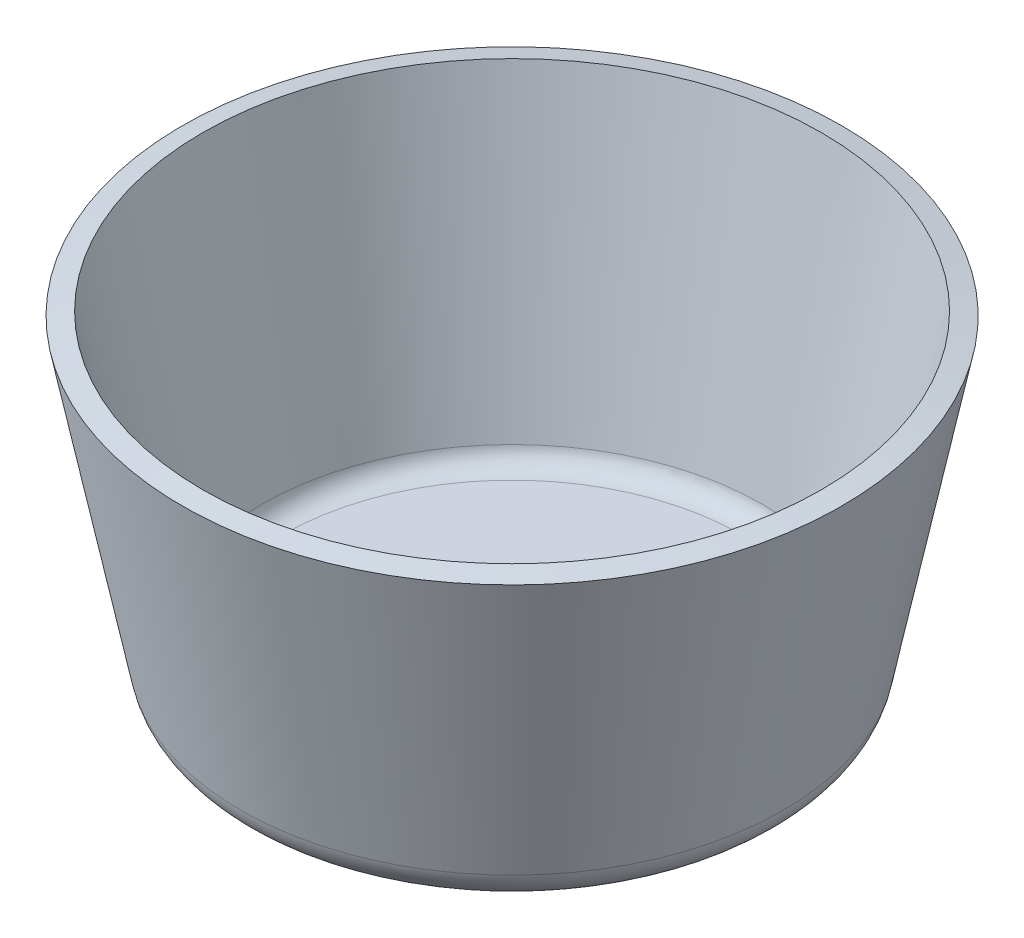
ISO-10303-21;
HEADER;
FILE_DESCRIPTION(('STEP AP214'),'2;1');
FILE_NAME('part.step','',(''),(''),'','','');
FILE_SCHEMA(('AUTOMOTIVE_DESIGN { 1 0 10303 214 1 1 1 1 }'));
ENDSEC;
DATA;
#1=APPLICATION_CONTEXT('core data for automotive mechanical design processes');
#2=APPLICATION_PROTOCOL_DEFINITION('international standard','automotive_design',2000,#1);
#3=PRODUCT_CONTEXT('',#1,'mechanical');
#4=PRODUCT('Part','Part','',(#3));
#5=PRODUCT_RELATED_PRODUCT_CATEGORY('part','',(#4));
#6=PRODUCT_DEFINITION_FORMATION('','',#4);
#7=PRODUCT_DEFINITION_CONTEXT('part definition',#1,'design');
#8=PRODUCT_DEFINITION('design','',#6,#7);
#9=PRODUCT_DEFINITION_SHAPE('','',#8);
#10=(LENGTH_UNIT() NAMED_UNIT(*) SI_UNIT(.MILLI.,.METRE.));
#11=(NAMED_UNIT(*) PLANE_ANGLE_UNIT() SI_UNIT($,.RADIAN.));
#12=(NAMED_UNIT(*) SI_UNIT($,.STERADIAN.) SOLID_ANGLE_UNIT());
#13=UNCERTAINTY_MEASURE_WITH_UNIT(LENGTH_MEASURE(1.E-05),#10,'distance_accuracy_value','');
#14=(GEOMETRIC_REPRESENTATION_CONTEXT(3) GLOBAL_UNCERTAINTY_ASSIGNED_CONTEXT((#13)) GLOBAL_UNIT_ASSIGNED_CONTEXT((#10,
#11,#12)) REPRESENTATION_CONTEXT('',''));
#15=CARTESIAN_POINT('',(0.,0.,0.));
#16=DIRECTION('',(0.,0.,1.));
#17=DIRECTION('',(1.,0.,0.));
#18=AXIS2_PLACEMENT_3D('',#15,#16,#17);
#19=CARTESIAN_POINT('',(0.,6.07767729723638,0.));
#20=DIRECTION('',(0.,1.,0.));
#21=DIRECTION('',(0.,0.,1.));
#22=AXIS2_PLACEMENT_3D('',#19,#20,#21);
#23=CONICAL_SURFACE('',#22,131.413574486633,0.197395559849881);
#24=CARTESIAN_POINT('',(0.,148.038838648618,0.));
#25=DIRECTION('',(0.,-1.,0.));
#26=DIRECTION('',(0.,0.,-1.));
#27=AXIS2_PLACEMENT_3D('',#24,#25,#26);
#28=CIRCLE('',#27,159.805806756909);
#29=CARTESIAN_POINT('',(0.,148.038838648618,-159.805806756909));
#30=VERTEX_POINT('',#29);
#31=EDGE_CURVE('E10',#30,#30,#28,.T.);
#32=ORIENTED_EDGE('',*,*,#31,.T.);
#33=EDGE_LOOP('',(#32));
#34=FACE_BOUND('',#33,.T.);
#35=CARTESIAN_POINT('',(0.,6.07767729723638,0.));
#36=DIRECTION('',(0.,-1.,0.));
#37=DIRECTION('',(0.,0.,-1.));
#38=AXIS2_PLACEMENT_3D('',#35,#36,#37);
#39=CIRCLE('',#38,131.413574486633);
#40=CARTESIAN_POINT('',(0.,6.07767729723638,-131.413574486633));
#41=VERTEX_POINT('',#40);
#42=EDGE_CURVE('E57',#41,#41,#39,.T.);
#43=ORIENTED_EDGE('',*,*,#42,.F.);
#44=EDGE_LOOP('',(#43));
#45=FACE_BOUND('',#44,.T.);
#46=ADVANCED_FACE('F35',(#34,#45),#23,.T.);
#47=CARTESIAN_POINT('',(0.,150.,0.));
#48=DIRECTION('',(0.,-1.,0.));
#49=DIRECTION('',(0.,0.,-1.));
#50=AXIS2_PLACEMENT_3D('',#47,#48,#49);
#51=CONICAL_SURFACE('',#50,150.,1.37340076694502);
#52=ORIENTED_EDGE('',*,*,#31,.F.);
#53=EDGE_LOOP('',(#52));
#54=FACE_BOUND('',#53,.T.);
#55=CARTESIAN_POINT('',(0.,150.,0.));
#56=DIRECTION('',(0.,-1.,0.));
#57=DIRECTION('',(0.,0.,-1.));
#58=AXIS2_PLACEMENT_3D('',#55,#56,#57);
#59=CIRCLE('',#58,150.);
#60=CARTESIAN_POINT('',(0.,150.,-150.));
#61=VERTEX_POINT('',#60);
#62=EDGE_CURVE('E41',#61,#61,#59,.T.);
#63=ORIENTED_EDGE('',*,*,#62,.T.);
#64=EDGE_LOOP('',(#63));
#65=FACE_BOUND('',#64,.T.);
#66=ADVANCED_FACE('F65',(#54,#65),#51,.T.);
#67=CARTESIAN_POINT('',(0.,8.03883864861822,0.));
#68=DIRECTION('',(0.,1.,0.));
#69=DIRECTION('',(0.,0.,1.));
#70=AXIS2_PLACEMENT_3D('',#67,#68,#69);
#71=CONICAL_SURFACE('',#70,121.607767729724,0.197395559849881);
#72=ORIENTED_EDGE('',*,*,#62,.F.);
#73=EDGE_LOOP('',(#72));
#74=FACE_BOUND('',#73,.T.);
#75=CARTESIAN_POINT('',(0.,8.03883864861822,0.));
#76=DIRECTION('',(0.,-1.,0.));
#77=DIRECTION('',(0.,0.,-1.));
#78=AXIS2_PLACEMENT_3D('',#75,#76,#77);
#79=CIRCLE('',#78,121.607767729724);
#80=CARTESIAN_POINT('',(0.,8.03883864861822,-121.607767729724));
#81=VERTEX_POINT('',#80);
#82=EDGE_CURVE('E45',#81,#81,#79,.T.);
#83=ORIENTED_EDGE('',*,*,#82,.T.);
#84=EDGE_LOOP('',(#83));
#85=FACE_BOUND('',#84,.T.);
#86=ADVANCED_FACE('F69',(#74,#85),#71,.F.);
#87=CARTESIAN_POINT('',(0.,10.,0.));
#88=DIRECTION('',(0.,-1.,0.));
#89=DIRECTION('',(0.,0.,-1.));
#90=AXIS2_PLACEMENT_3D('',#87,#88,#89);
#91=TOROIDAL_SURFACE('',#90,111.801960972814,10.);
#92=ORIENTED_EDGE('',*,*,#82,.F.);
#93=EDGE_LOOP('',(#92));
#94=FACE_BOUND('',#93,.T.);
#95=CARTESIAN_POINT('',(0.,0.,0.));
#96=DIRECTION('',(0.,-1.,0.));
#97=DIRECTION('',(0.,0.,-1.));
#98=AXIS2_PLACEMENT_3D('',#95,#96,#97);
#99=CIRCLE('',#98,111.801960972814);
#100=CARTESIAN_POINT('',(0.,0.,-111.801960972814));
#101=VERTEX_POINT('',#100);
#102=EDGE_CURVE('E49',#101,#101,#99,.T.);
#103=ORIENTED_EDGE('',*,*,#102,.T.);
#104=EDGE_LOOP('',(#103));
#105=FACE_BOUND('',#104,.T.);
#106=ADVANCED_FACE('F74',(#94,#105),#91,.F.);
#107=CARTESIAN_POINT('',(0.,0.,0.));
#108=DIRECTION('',(0.,-1.,0.));
#109=DIRECTION('',(0.,0.,-1.));
#110=AXIS2_PLACEMENT_3D('',#107,#108,#109);
#111=PLANE('',#110);
#112=ORIENTED_EDGE('',*,*,#102,.F.);
#113=EDGE_LOOP('',(#112));
#114=FACE_BOUND('',#113,.T.);
#115=ADVANCED_FACE('F80',(#114),#111,.F.);
#116=CARTESIAN_POINT('',(0.,-10.,0.));
#117=DIRECTION('',(0.,-1.,0.));
#118=DIRECTION('',(0.,0.,-1.));
#119=AXIS2_PLACEMENT_3D('',#116,#117,#118);
#120=PLANE('',#119);
#121=CARTESIAN_POINT('',(0.,-10.,0.));
#122=DIRECTION('',(0.,-1.,0.));
#123=DIRECTION('',(0.,0.,-1.));
#124=AXIS2_PLACEMENT_3D('',#121,#122,#123);
#125=CIRCLE('',#124,111.801960972814);
#126=CARTESIAN_POINT('',(0.,-10.,-111.801960972814));
#127=VERTEX_POINT('',#126);
#128=EDGE_CURVE('E54',#127,#127,#125,.T.);
#129=ORIENTED_EDGE('',*,*,#128,.T.);
#130=EDGE_LOOP('',(#129));
#131=FACE_BOUND('',#130,.T.);
#132=ADVANCED_FACE('F84',(#131),#120,.T.);
#133=CARTESIAN_POINT('',(0.,10.,0.));
#134=DIRECTION('',(0.,-1.,0.));
#135=DIRECTION('',(0.,0.,-1.));
#136=AXIS2_PLACEMENT_3D('',#133,#134,#135);
#137=TOROIDAL_SURFACE('',#136,111.801960972814,20.);
#138=ORIENTED_EDGE('',*,*,#42,.T.);
#139=EDGE_LOOP('',(#138));
#140=FACE_BOUND('',#139,.T.);
#141=ORIENTED_EDGE('',*,*,#128,.F.);
#142=EDGE_LOOP('',(#141));
#143=FACE_BOUND('',#142,.T.);
#144=ADVANCED_FACE('F61',(#140,#143),#137,.T.);
#145=CLOSED_SHELL('',(#46,#66,#86,#106,#115,#132,#144));
#146=MANIFOLD_SOLID_BREP('B2',#145);
#147=ADVANCED_BREP_SHAPE_REPRESENTATION('',(#18,#146),#14);
#148=SHAPE_DEFINITION_REPRESENTATION(#9,#147);
ENDSEC;
END-ISO-10303-21;
